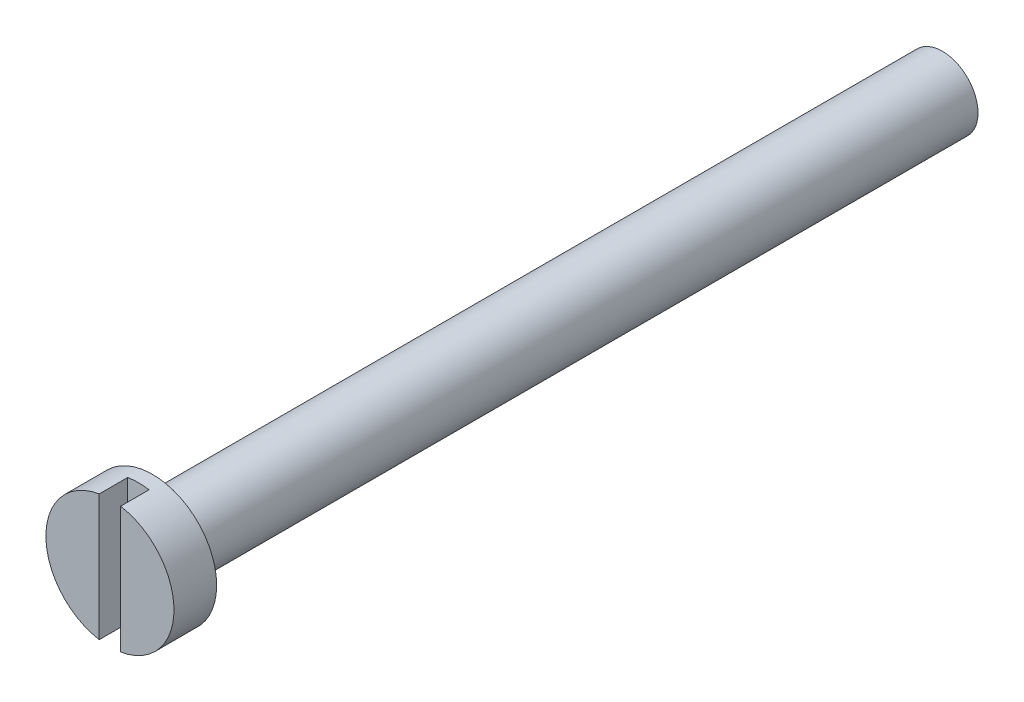
ISO-10303-21;
HEADER;
FILE_DESCRIPTION(('STEP AP214'),'2;1');
FILE_NAME('part.step','',(''),(''),'','','');
FILE_SCHEMA(('AUTOMOTIVE_DESIGN { 1 0 10303 214 1 1 1 1 }'));
ENDSEC;
DATA;
#1=APPLICATION_CONTEXT('core data for automotive mechanical design processes');
#2=APPLICATION_PROTOCOL_DEFINITION('international standard','automotive_design',2000,#1);
#3=PRODUCT_CONTEXT('',#1,'mechanical');
#4=PRODUCT('Part','Part','',(#3));
#5=PRODUCT_RELATED_PRODUCT_CATEGORY('part','',(#4));
#6=PRODUCT_DEFINITION_FORMATION('','',#4);
#7=PRODUCT_DEFINITION_CONTEXT('part definition',#1,'design');
#8=PRODUCT_DEFINITION('design','',#6,#7);
#9=PRODUCT_DEFINITION_SHAPE('','',#8);
#10=(LENGTH_UNIT() NAMED_UNIT(*) SI_UNIT(.MILLI.,.METRE.));
#11=(NAMED_UNIT(*) PLANE_ANGLE_UNIT() SI_UNIT($,.RADIAN.));
#12=(NAMED_UNIT(*) SI_UNIT($,.STERADIAN.) SOLID_ANGLE_UNIT());
#13=UNCERTAINTY_MEASURE_WITH_UNIT(LENGTH_MEASURE(1.E-05),#10,'distance_accuracy_value','');
#14=(GEOMETRIC_REPRESENTATION_CONTEXT(3) GLOBAL_UNCERTAINTY_ASSIGNED_CONTEXT((#13)) GLOBAL_UNIT_ASSIGNED_CONTEXT((#10,
#11,#12)) REPRESENTATION_CONTEXT('',''));
#15=CARTESIAN_POINT('',(0.,0.,0.));
#16=DIRECTION('',(0.,0.,1.));
#17=DIRECTION('',(1.,0.,0.));
#18=AXIS2_PLACEMENT_3D('',#15,#16,#17);
#19=CARTESIAN_POINT('',(0.,0.,58.5));
#20=DIRECTION('',(0.,0.,1.));
#21=DIRECTION('',(1.,0.,0.));
#22=AXIS2_PLACEMENT_3D('',#19,#20,#21);
#23=PLANE('',#22);
#24=DIRECTION('',(0.,1.,0.));
#25=VECTOR('',#24,1.);
#26=CARTESIAN_POINT('',(0.75,0.,58.5));
#27=LINE('',#26,#25);
#28=CARTESIAN_POINT('',(0.750000000000001,-4.43705983732471,58.5));
#29=VERTEX_POINT('',#28);
#30=CARTESIAN_POINT('',(0.75,4.43705983732471,58.5));
#31=VERTEX_POINT('',#30);
#32=EDGE_CURVE('E126',#29,#31,#27,.T.);
#33=ORIENTED_EDGE('',*,*,#32,.F.);
#34=CARTESIAN_POINT('',(0.,0.,58.5));
#35=DIRECTION('',(0.,0.,1.));
#36=DIRECTION('',(1.,0.,0.));
#37=AXIS2_PLACEMENT_3D('',#34,#35,#36);
#38=CIRCLE('',#37,4.5);
#39=EDGE_CURVE('E113',#29,#31,#38,.T.);
#40=ORIENTED_EDGE('',*,*,#39,.T.);
#41=EDGE_LOOP('',(#33,#40));
#42=FACE_BOUND('',#41,.T.);
#43=ADVANCED_FACE('F41',(#42),#23,.T.);
#44=CARTESIAN_POINT('',(0.,0.,55.5));
#45=DIRECTION('',(0.,0.,-1.));
#46=DIRECTION('',(-1.,0.,0.));
#47=AXIS2_PLACEMENT_3D('',#44,#45,#46);
#48=CYLINDRICAL_SURFACE('',#47,2.5);
#49=CARTESIAN_POINT('',(0.,0.,55.5));
#50=DIRECTION('',(0.,0.,1.));
#51=DIRECTION('',(1.,0.,0.));
#52=AXIS2_PLACEMENT_3D('',#49,#50,#51);
#53=CIRCLE('',#52,2.5);
#54=CARTESIAN_POINT('',(2.5,0.,55.5));
#55=VERTEX_POINT('',#54);
#56=EDGE_CURVE('E119',#55,#55,#53,.T.);
#57=ORIENTED_EDGE('',*,*,#56,.F.);
#58=EDGE_LOOP('',(#57));
#59=FACE_BOUND('',#58,.T.);
#60=CARTESIAN_POINT('',(0.,0.,0.));
#61=DIRECTION('',(0.,0.,1.));
#62=DIRECTION('',(1.,0.,0.));
#63=AXIS2_PLACEMENT_3D('',#60,#61,#62);
#64=CIRCLE('',#63,2.5);
#65=CARTESIAN_POINT('',(2.5,0.,0.));
#66=VERTEX_POINT('',#65);
#67=EDGE_CURVE('E123',#66,#66,#64,.T.);
#68=ORIENTED_EDGE('',*,*,#67,.T.);
#69=EDGE_LOOP('',(#68));
#70=FACE_BOUND('',#69,.T.);
#71=ADVANCED_FACE('F43',(#59,#70),#48,.T.);
#72=CARTESIAN_POINT('',(0.,0.,0.));
#73=DIRECTION('',(0.,0.,1.));
#74=DIRECTION('',(1.,0.,0.));
#75=AXIS2_PLACEMENT_3D('',#72,#73,#74);
#76=PLANE('',#75);
#77=CARTESIAN_POINT('',(0.,0.,0.));
#78=DIRECTION('',(0.,0.,-1.));
#79=DIRECTION('',(-1.,0.,0.));
#80=AXIS2_PLACEMENT_3D('',#77,#78,#79);
#81=CIRCLE('',#80,1.25);
#82=CARTESIAN_POINT('',(-1.25,0.,0.));
#83=VERTEX_POINT('',#82);
#84=EDGE_CURVE('E95',#83,#83,#81,.T.);
#85=ORIENTED_EDGE('',*,*,#84,.F.);
#86=EDGE_LOOP('',(#85));
#87=FACE_BOUND('',#86,.T.);
#88=ORIENTED_EDGE('',*,*,#67,.F.);
#89=EDGE_LOOP('',(#88));
#90=FACE_BOUND('',#89,.T.);
#91=ADVANCED_FACE('F144',(#87,#90),#76,.F.);
#92=CARTESIAN_POINT('',(0.,0.,58.5));
#93=DIRECTION('',(0.,0.,-1.));
#94=DIRECTION('',(-1.,0.,0.));
#95=AXIS2_PLACEMENT_3D('',#92,#93,#94);
#96=CYLINDRICAL_SURFACE('',#95,4.5);
#97=CARTESIAN_POINT('',(0.,0.,56.5));
#98=DIRECTION('',(0.,0.,1.));
#99=DIRECTION('',(1.,0.,0.));
#100=AXIS2_PLACEMENT_3D('',#97,#98,#99);
#101=CIRCLE('',#100,4.5);
#102=CARTESIAN_POINT('',(0.75,4.43705983732471,56.5));
#103=VERTEX_POINT('',#102);
#104=CARTESIAN_POINT('',(-0.75,4.43705983732471,56.5));
#105=VERTEX_POINT('',#104);
#106=EDGE_CURVE('E11',#103,#105,#101,.T.);
#107=ORIENTED_EDGE('',*,*,#106,.F.);
#108=DIRECTION('',(0.,0.,-1.));
#109=VECTOR('',#108,1.);
#110=CARTESIAN_POINT('',(0.75,4.43705983732471,58.5));
#111=LINE('',#110,#109);
#112=EDGE_CURVE('E64',#103,#31,#111,.F.);
#113=ORIENTED_EDGE('',*,*,#112,.T.);
#114=ORIENTED_EDGE('',*,*,#39,.F.);
#115=DIRECTION('',(0.,0.,-1.));
#116=VECTOR('',#115,1.);
#117=CARTESIAN_POINT('',(0.750000000000001,-4.43705983732471,58.5));
#118=LINE('',#117,#116);
#119=CARTESIAN_POINT('',(0.750000000000001,-4.43705983732471,56.5));
#120=VERTEX_POINT('',#119);
#121=EDGE_CURVE('E109',#29,#120,#118,.T.);
#122=ORIENTED_EDGE('',*,*,#121,.T.);
#123=CARTESIAN_POINT('',(-0.749999999999999,-4.43705983732471,56.5));
#124=VERTEX_POINT('',#123);
#125=EDGE_CURVE('E45',#124,#120,#101,.T.);
#126=ORIENTED_EDGE('',*,*,#125,.F.);
#127=DIRECTION('',(0.,0.,-1.));
#128=VECTOR('',#127,1.);
#129=CARTESIAN_POINT('',(-0.749999999999999,-4.43705983732471,58.5));
#130=LINE('',#129,#128);
#131=CARTESIAN_POINT('',(-0.749999999999999,-4.43705983732471,58.5));
#132=VERTEX_POINT('',#131);
#133=EDGE_CURVE('E104',#124,#132,#130,.F.);
#134=ORIENTED_EDGE('',*,*,#133,.T.);
#135=CARTESIAN_POINT('',(-0.75,4.43705983732471,58.5));
#136=VERTEX_POINT('',#135);
#137=EDGE_CURVE('E116',#136,#132,#38,.T.);
#138=ORIENTED_EDGE('',*,*,#137,.F.);
#139=DIRECTION('',(0.,0.,-1.));
#140=VECTOR('',#139,1.);
#141=CARTESIAN_POINT('',(-0.75,4.43705983732471,58.5));
#142=LINE('',#141,#140);
#143=EDGE_CURVE('E56',#136,#105,#142,.T.);
#144=ORIENTED_EDGE('',*,*,#143,.T.);
#145=EDGE_LOOP('',(#107,#113,#114,#122,#126,#134,#138,#144));
#146=FACE_BOUND('',#145,.T.);
#147=CARTESIAN_POINT('',(0.,0.,55.5));
#148=DIRECTION('',(0.,0.,1.));
#149=DIRECTION('',(1.,0.,0.));
#150=AXIS2_PLACEMENT_3D('',#147,#148,#149);
#151=CIRCLE('',#150,4.5);
#152=CARTESIAN_POINT('',(4.5,0.,55.5));
#153=VERTEX_POINT('',#152);
#154=EDGE_CURVE('E112',#153,#153,#151,.T.);
#155=ORIENTED_EDGE('',*,*,#154,.T.);
#156=EDGE_LOOP('',(#155));
#157=FACE_BOUND('',#156,.T.);
#158=ADVANCED_FACE('F135',(#146,#157),#96,.T.);
#159=DIRECTION('',(0.,-1.,0.));
#160=VECTOR('',#159,1.);
#161=CARTESIAN_POINT('',(-0.75,0.,58.5));
#162=LINE('',#161,#160);
#163=EDGE_CURVE('E122',#136,#132,#162,.T.);
#164=ORIENTED_EDGE('',*,*,#163,.F.);
#165=ORIENTED_EDGE('',*,*,#137,.T.);
#166=EDGE_LOOP('',(#164,#165));
#167=FACE_BOUND('',#166,.T.);
#168=ADVANCED_FACE('F140',(#167),#23,.T.);
#169=CARTESIAN_POINT('',(0.,0.,55.5));
#170=DIRECTION('',(0.,0.,1.));
#171=DIRECTION('',(1.,0.,0.));
#172=AXIS2_PLACEMENT_3D('',#169,#170,#171);
#173=PLANE('',#172);
#174=ORIENTED_EDGE('',*,*,#56,.T.);
#175=EDGE_LOOP('',(#174));
#176=FACE_BOUND('',#175,.T.);
#177=ORIENTED_EDGE('',*,*,#154,.F.);
#178=EDGE_LOOP('',(#177));
#179=FACE_BOUND('',#178,.T.);
#180=ADVANCED_FACE('F149',(#176,#179),#173,.F.);
#181=CARTESIAN_POINT('',(0.,0.,56.5));
#182=DIRECTION('',(0.,0.,1.));
#183=DIRECTION('',(1.,0.,0.));
#184=AXIS2_PLACEMENT_3D('',#181,#182,#183);
#185=PLANE('',#184);
#186=ORIENTED_EDGE('',*,*,#106,.T.);
#187=DIRECTION('',(0.,-1.,0.));
#188=VECTOR('',#187,1.);
#189=CARTESIAN_POINT('',(-0.75,5.46844597131234,56.5));
#190=LINE('',#189,#188);
#191=EDGE_CURVE('E97',#105,#124,#190,.T.);
#192=ORIENTED_EDGE('',*,*,#191,.T.);
#193=ORIENTED_EDGE('',*,*,#125,.T.);
#194=DIRECTION('',(0.,1.,0.));
#195=VECTOR('',#194,1.);
#196=CARTESIAN_POINT('',(0.75,5.46844597131234,56.5));
#197=LINE('',#196,#195);
#198=EDGE_CURVE('E94',#120,#103,#197,.T.);
#199=ORIENTED_EDGE('',*,*,#198,.T.);
#200=EDGE_LOOP('',(#186,#192,#193,#199));
#201=FACE_BOUND('',#200,.T.);
#202=ADVANCED_FACE('F130',(#201),#185,.T.);
#203=CARTESIAN_POINT('',(0.75,5.46844597131234,56.5));
#204=DIRECTION('',(1.,0.,0.));
#205=DIRECTION('',(0.,1.,0.));
#206=AXIS2_PLACEMENT_3D('',#203,#204,#205);
#207=PLANE('',#206);
#208=ORIENTED_EDGE('',*,*,#32,.T.);
#209=ORIENTED_EDGE('',*,*,#112,.F.);
#210=ORIENTED_EDGE('',*,*,#198,.F.);
#211=ORIENTED_EDGE('',*,*,#121,.F.);
#212=EDGE_LOOP('',(#208,#209,#210,#211));
#213=FACE_BOUND('',#212,.T.);
#214=ADVANCED_FACE('F133',(#213),#207,.F.);
#215=CARTESIAN_POINT('',(-0.75,5.46844597131234,56.5));
#216=DIRECTION('',(-1.,0.,0.));
#217=DIRECTION('',(0.,-1.,0.));
#218=AXIS2_PLACEMENT_3D('',#215,#216,#217);
#219=PLANE('',#218);
#220=ORIENTED_EDGE('',*,*,#163,.T.);
#221=ORIENTED_EDGE('',*,*,#133,.F.);
#222=ORIENTED_EDGE('',*,*,#191,.F.);
#223=ORIENTED_EDGE('',*,*,#143,.F.);
#224=EDGE_LOOP('',(#220,#221,#222,#223));
#225=FACE_BOUND('',#224,.T.);
#226=ADVANCED_FACE('F88',(#225),#219,.F.);
#227=CARTESIAN_POINT('',(0.,0.,10.));
#228=DIRECTION('',(0.,0.,-1.));
#229=DIRECTION('',(-1.,0.,0.));
#230=AXIS2_PLACEMENT_3D('',#227,#228,#229);
#231=CONICAL_SURFACE('',#230,1.25,1.02974425867665);
#232=CARTESIAN_POINT('',(0.,0.,10.7510757737845));
#233=VERTEX_POINT('',#232);
#234=VERTEX_LOOP('',#233);
#235=FACE_BOUND('',#234,.T.);
#236=CARTESIAN_POINT('',(0.,0.,10.));
#237=DIRECTION('',(0.,0.,-1.));
#238=DIRECTION('',(-1.,0.,0.));
#239=AXIS2_PLACEMENT_3D('',#236,#237,#238);
#240=CIRCLE('',#239,1.25);
#241=CARTESIAN_POINT('',(-1.25,0.,10.));
#242=VERTEX_POINT('',#241);
#243=EDGE_CURVE('E92',#242,#242,#240,.T.);
#244=ORIENTED_EDGE('',*,*,#243,.T.);
#245=EDGE_LOOP('',(#244));
#246=FACE_BOUND('',#245,.T.);
#247=ADVANCED_FACE('F84',(#235,#246),#231,.F.);
#248=CARTESIAN_POINT('',(0.,0.,0.));
#249=DIRECTION('',(0.,0.,-1.));
#250=DIRECTION('',(-1.,0.,0.));
#251=AXIS2_PLACEMENT_3D('',#248,#249,#250);
#252=CYLINDRICAL_SURFACE('',#251,1.25);
#253=ORIENTED_EDGE('',*,*,#243,.F.);
#254=EDGE_LOOP('',(#253));
#255=FACE_BOUND('',#254,.T.);
#256=ORIENTED_EDGE('',*,*,#84,.T.);
#257=EDGE_LOOP('',(#256));
#258=FACE_BOUND('',#257,.T.);
#259=ADVANCED_FACE('F87',(#255,#258),#252,.F.);
#260=CLOSED_SHELL('',(#43,#71,#91,#158,#168,#180,#202,#214,#226,#247,#259));
#261=MANIFOLD_SOLID_BREP('B2',#260);
#262=ADVANCED_BREP_SHAPE_REPRESENTATION('',(#18,#261),#14);
#263=SHAPE_DEFINITION_REPRESENTATION(#9,#262);
ENDSEC;
END-ISO-10303-21;
